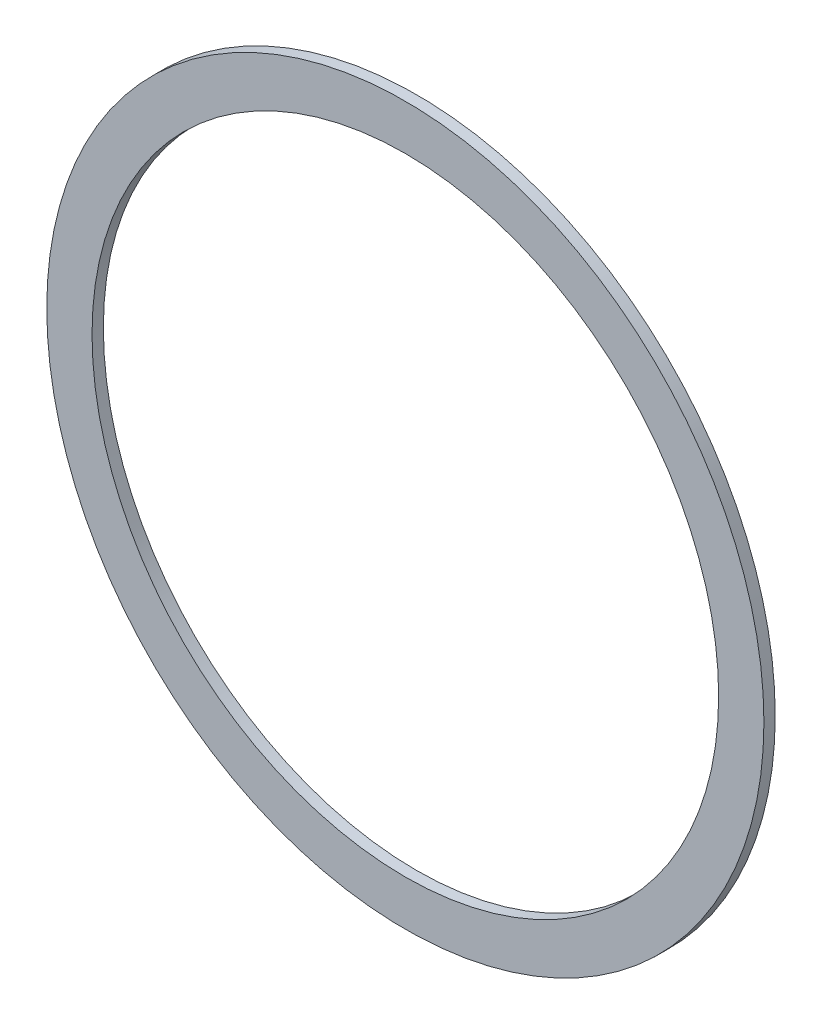
ISO-10303-21;
HEADER;
FILE_DESCRIPTION(('STEP AP214'),'2;1');
FILE_NAME('part.step','',(''),(''),'','','');
FILE_SCHEMA(('AUTOMOTIVE_DESIGN { 1 0 10303 214 1 1 1 1 }'));
ENDSEC;
DATA;
#1=APPLICATION_CONTEXT('core data for automotive mechanical design processes');
#2=APPLICATION_PROTOCOL_DEFINITION('international standard','automotive_design',2000,#1);
#3=PRODUCT_CONTEXT('',#1,'mechanical');
#4=PRODUCT('Part','Part','',(#3));
#5=PRODUCT_RELATED_PRODUCT_CATEGORY('part','',(#4));
#6=PRODUCT_DEFINITION_FORMATION('','',#4);
#7=PRODUCT_DEFINITION_CONTEXT('part definition',#1,'design');
#8=PRODUCT_DEFINITION('design','',#6,#7);
#9=PRODUCT_DEFINITION_SHAPE('','',#8);
#10=(LENGTH_UNIT() NAMED_UNIT(*) SI_UNIT(.MILLI.,.METRE.));
#11=(NAMED_UNIT(*) PLANE_ANGLE_UNIT() SI_UNIT($,.RADIAN.));
#12=(NAMED_UNIT(*) SI_UNIT($,.STERADIAN.) SOLID_ANGLE_UNIT());
#13=UNCERTAINTY_MEASURE_WITH_UNIT(LENGTH_MEASURE(1.E-05),#10,'distance_accuracy_value','');
#14=(GEOMETRIC_REPRESENTATION_CONTEXT(3) GLOBAL_UNCERTAINTY_ASSIGNED_CONTEXT((#13)) GLOBAL_UNIT_ASSIGNED_CONTEXT((#10,
#11,#12)) REPRESENTATION_CONTEXT('',''));
#15=CARTESIAN_POINT('',(0.,0.,0.));
#16=DIRECTION('',(0.,0.,1.));
#17=DIRECTION('',(1.,0.,0.));
#18=AXIS2_PLACEMENT_3D('',#15,#16,#17);
#19=CARTESIAN_POINT('',(0.,6.07817424837746,-3.175));
#20=DIRECTION('',(0.,0.,1.));
#21=DIRECTION('',(1.,0.,0.));
#22=AXIS2_PLACEMENT_3D('',#19,#20,#21);
#23=CYLINDRICAL_SURFACE('',#22,100.601825751622);
#24=CARTESIAN_POINT('',(0.,6.07817424837746,0.));
#25=DIRECTION('',(0.,0.,1.));
#26=DIRECTION('',(1.,0.,0.));
#27=AXIS2_PLACEMENT_3D('',#24,#25,#26);
#28=CIRCLE('',#27,100.601825751622);
#29=CARTESIAN_POINT('',(100.601825751622,6.07817424837746,0.));
#30=VERTEX_POINT('',#29);
#31=EDGE_CURVE('E38',#30,#30,#28,.T.);
#32=ORIENTED_EDGE('',*,*,#31,.F.);
#33=EDGE_LOOP('',(#32));
#34=FACE_BOUND('',#33,.T.);
#35=CARTESIAN_POINT('',(0.,6.07817424837746,-3.175));
#36=DIRECTION('',(0.,0.,1.));
#37=DIRECTION('',(1.,0.,0.));
#38=AXIS2_PLACEMENT_3D('',#35,#36,#37);
#39=CIRCLE('',#38,100.601825751622);
#40=CARTESIAN_POINT('',(100.601825751622,6.07817424837746,-3.175));
#41=VERTEX_POINT('',#40);
#42=EDGE_CURVE('E10',#41,#41,#39,.T.);
#43=ORIENTED_EDGE('',*,*,#42,.T.);
#44=EDGE_LOOP('',(#43));
#45=FACE_BOUND('',#44,.T.);
#46=ADVANCED_FACE('F35',(#34,#45),#23,.T.);
#47=CARTESIAN_POINT('',(0.,6.07817424837746,-3.175));
#48=DIRECTION('',(0.,0.,1.));
#49=DIRECTION('',(1.,0.,0.));
#50=AXIS2_PLACEMENT_3D('',#47,#48,#49);
#51=PLANE('',#50);
#52=CARTESIAN_POINT('',(0.,6.07817424837746,-3.175));
#53=DIRECTION('',(0.,0.,1.));
#54=DIRECTION('',(1.,0.,0.));
#55=AXIS2_PLACEMENT_3D('',#52,#53,#54);
#56=CIRCLE('',#55,87.9018257516225);
#57=CARTESIAN_POINT('',(87.9018257516225,6.07817424837746,-3.175));
#58=VERTEX_POINT('',#57);
#59=EDGE_CURVE('E45',#58,#58,#56,.T.);
#60=ORIENTED_EDGE('',*,*,#59,.T.);
#61=EDGE_LOOP('',(#60));
#62=FACE_BOUND('',#61,.T.);
#63=ORIENTED_EDGE('',*,*,#42,.F.);
#64=EDGE_LOOP('',(#63));
#65=FACE_BOUND('',#64,.T.);
#66=ADVANCED_FACE('F53',(#62,#65),#51,.F.);
#67=CARTESIAN_POINT('',(0.,6.07817424837746,0.));
#68=DIRECTION('',(0.,0.,1.));
#69=DIRECTION('',(1.,0.,0.));
#70=AXIS2_PLACEMENT_3D('',#67,#68,#69);
#71=PLANE('',#70);
#72=CARTESIAN_POINT('',(0.,6.07817424837746,0.));
#73=DIRECTION('',(0.,0.,1.));
#74=DIRECTION('',(1.,0.,0.));
#75=AXIS2_PLACEMENT_3D('',#72,#73,#74);
#76=CIRCLE('',#75,87.9018257516225);
#77=CARTESIAN_POINT('',(87.9018257516225,6.07817424837746,0.));
#78=VERTEX_POINT('',#77);
#79=EDGE_CURVE('E47',#78,#78,#76,.T.);
#80=ORIENTED_EDGE('',*,*,#79,.F.);
#81=EDGE_LOOP('',(#80));
#82=FACE_BOUND('',#81,.T.);
#83=ORIENTED_EDGE('',*,*,#31,.T.);
#84=EDGE_LOOP('',(#83));
#85=FACE_BOUND('',#84,.T.);
#86=ADVANCED_FACE('F58',(#82,#85),#71,.T.);
#87=CARTESIAN_POINT('',(0.,6.07817424837746,-3.175));
#88=DIRECTION('',(0.,0.,1.));
#89=DIRECTION('',(1.,0.,0.));
#90=AXIS2_PLACEMENT_3D('',#87,#88,#89);
#91=CYLINDRICAL_SURFACE('',#90,87.9018257516225);
#92=ORIENTED_EDGE('',*,*,#79,.T.);
#93=EDGE_LOOP('',(#92));
#94=FACE_BOUND('',#93,.T.);
#95=ORIENTED_EDGE('',*,*,#59,.F.);
#96=EDGE_LOOP('',(#95));
#97=FACE_BOUND('',#96,.T.);
#98=ADVANCED_FACE('F56',(#94,#97),#91,.F.);
#99=CLOSED_SHELL('',(#46,#66,#86,#98));
#100=MANIFOLD_SOLID_BREP('B2',#99);
#101=ADVANCED_BREP_SHAPE_REPRESENTATION('',(#18,#100),#14);
#102=SHAPE_DEFINITION_REPRESENTATION(#9,#101);
ENDSEC;
END-ISO-10303-21;
